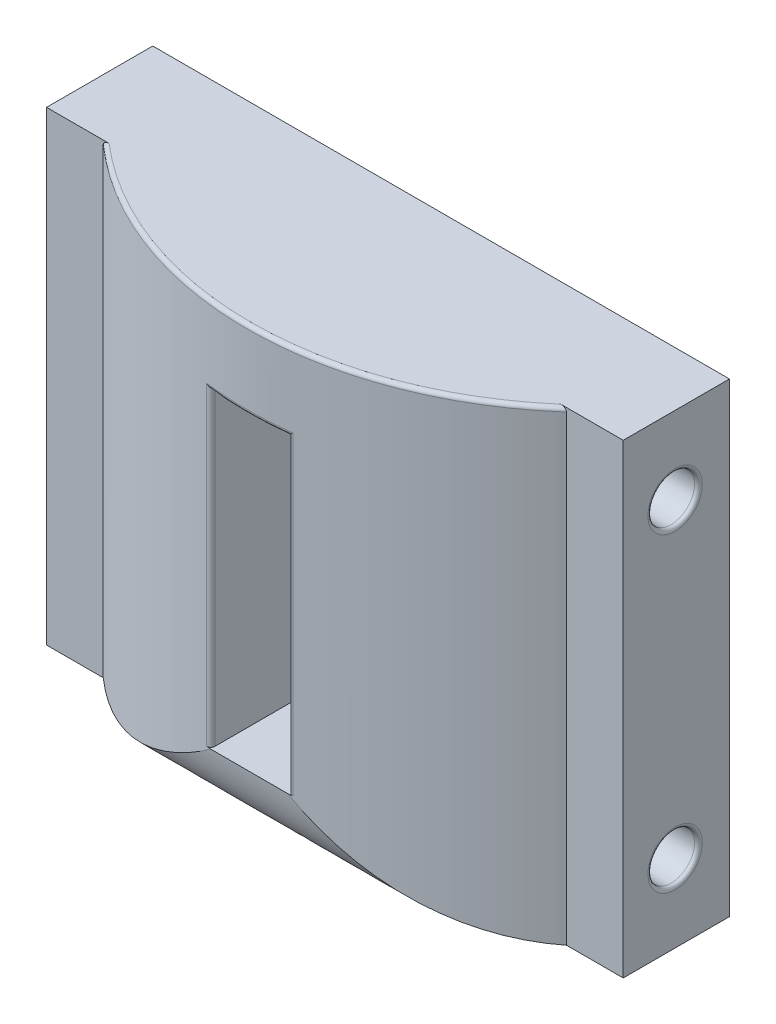
ISO-10303-21;
HEADER;
FILE_DESCRIPTION(('STEP AP214'),'2;1');
FILE_NAME('part.step','',(''),(''),'','','');
FILE_SCHEMA(('AUTOMOTIVE_DESIGN { 1 0 10303 214 1 1 1 1 }'));
ENDSEC;
DATA;
#1=APPLICATION_CONTEXT('core data for automotive mechanical design processes');
#2=APPLICATION_PROTOCOL_DEFINITION('international standard','automotive_design',2000,#1);
#3=PRODUCT_CONTEXT('',#1,'mechanical');
#4=PRODUCT('Part','Part','',(#3));
#5=PRODUCT_RELATED_PRODUCT_CATEGORY('part','',(#4));
#6=PRODUCT_DEFINITION_FORMATION('','',#4);
#7=PRODUCT_DEFINITION_CONTEXT('part definition',#1,'design');
#8=PRODUCT_DEFINITION('design','',#6,#7);
#9=PRODUCT_DEFINITION_SHAPE('','',#8);
#10=(LENGTH_UNIT() NAMED_UNIT(*) SI_UNIT(.MILLI.,.METRE.));
#11=(NAMED_UNIT(*) PLANE_ANGLE_UNIT() SI_UNIT($,.RADIAN.));
#12=(NAMED_UNIT(*) SI_UNIT($,.STERADIAN.) SOLID_ANGLE_UNIT());
#13=UNCERTAINTY_MEASURE_WITH_UNIT(LENGTH_MEASURE(1.E-05),#10,'distance_accuracy_value','');
#14=(GEOMETRIC_REPRESENTATION_CONTEXT(3) GLOBAL_UNCERTAINTY_ASSIGNED_CONTEXT((#13)) GLOBAL_UNIT_ASSIGNED_CONTEXT((#10,
#11,#12)) REPRESENTATION_CONTEXT('',''));
#15=CARTESIAN_POINT('',(0.,0.,0.));
#16=DIRECTION('',(0.,0.,1.));
#17=DIRECTION('',(1.,0.,0.));
#18=AXIS2_PLACEMENT_3D('',#15,#16,#17);
#19=CARTESIAN_POINT('',(12.425,25.,0.));
#20=DIRECTION('',(0.,1.,0.));
#21=DIRECTION('',(0.,0.,1.));
#22=AXIS2_PLACEMENT_3D('',#19,#20,#21);
#23=PLANE('',#22);
#24=DIRECTION('',(0.,0.,1.));
#25=VECTOR('',#24,1.);
#26=CARTESIAN_POINT('',(17.425,25.,0.));
#27=LINE('',#26,#25);
#28=CARTESIAN_POINT('',(17.425,25.,5.));
#29=VERTEX_POINT('',#28);
#30=CARTESIAN_POINT('',(17.425,25.,12.0795236098638));
#31=VERTEX_POINT('',#30);
#32=EDGE_CURVE('E199',#29,#31,#27,.T.);
#33=ORIENTED_EDGE('',*,*,#32,.T.);
#34=CARTESIAN_POINT('',(17.675,25.,12.0795236098638));
#35=DIRECTION('',(0.,1.,0.));
#36=DIRECTION('',(0.,0.,1.));
#37=AXIS2_PLACEMENT_3D('',#34,#35,#36);
#38=CIRCLE('',#37,0.249999999999997);
#39=CARTESIAN_POINT('',(17.4267446774114,25.,12.1090074156972));
#40=VERTEX_POINT('',#39);
#41=EDGE_CURVE('E366',#31,#40,#38,.T.);
#42=ORIENTED_EDGE('',*,*,#41,.T.);
#43=CARTESIAN_POINT('',(14.925,25.,-10.015728977273));
#44=DIRECTION('',(0.,1.,0.));
#45=DIRECTION('',(0.,0.,1.));
#46=AXIS2_PLACEMENT_3D('',#43,#44,#45);
#47=CIRCLE('',#46,22.265728977273);
#48=CARTESIAN_POINT('',(12.4232553225886,25.,12.1090074156972));
#49=VERTEX_POINT('',#48);
#50=EDGE_CURVE('E65',#40,#49,#47,.F.);
#51=ORIENTED_EDGE('',*,*,#50,.T.);
#52=CARTESIAN_POINT('',(12.175,25.,12.0795236098638));
#53=DIRECTION('',(0.,1.,0.));
#54=DIRECTION('',(0.,0.,1.));
#55=AXIS2_PLACEMENT_3D('',#52,#53,#54);
#56=CIRCLE('',#55,0.249999999999997);
#57=CARTESIAN_POINT('',(12.425,25.,12.0795236098638));
#58=VERTEX_POINT('',#57);
#59=EDGE_CURVE('E364',#49,#58,#56,.T.);
#60=ORIENTED_EDGE('',*,*,#59,.T.);
#61=DIRECTION('',(0.,0.,1.));
#62=VECTOR('',#61,1.);
#63=CARTESIAN_POINT('',(12.425,25.,0.));
#64=LINE('',#63,#62);
#65=CARTESIAN_POINT('',(12.425,25.,5.));
#66=VERTEX_POINT('',#65);
#67=EDGE_CURVE('E270',#66,#58,#64,.T.);
#68=ORIENTED_EDGE('',*,*,#67,.F.);
#69=DIRECTION('',(1.,0.,0.));
#70=VECTOR('',#69,1.);
#71=CARTESIAN_POINT('',(-3.65,25.,5.));
#72=LINE('',#71,#70);
#73=EDGE_CURVE('E290',#66,#29,#72,.T.);
#74=ORIENTED_EDGE('',*,*,#73,.T.);
#75=EDGE_LOOP('',(#33,#42,#51,#60,#68,#74));
#76=FACE_BOUND('',#75,.T.);
#77=ADVANCED_FACE('F34',(#76),#23,.F.);
#78=CARTESIAN_POINT('',(12.425,5.,0.));
#79=DIRECTION('',(0.,-1.,0.));
#80=DIRECTION('',(1.,0.,0.));
#81=AXIS2_PLACEMENT_3D('',#78,#79,#80);
#82=PLANE('',#81);
#83=DIRECTION('',(0.,0.,1.));
#84=VECTOR('',#83,1.);
#85=CARTESIAN_POINT('',(12.425,5.,0.));
#86=LINE('',#85,#84);
#87=CARTESIAN_POINT('',(12.425,5.,0.));
#88=VERTEX_POINT('',#87);
#89=CARTESIAN_POINT('',(12.425,4.99999999999999,2.));
#90=VERTEX_POINT('',#89);
#91=EDGE_CURVE('E193',#88,#90,#86,.T.);
#92=ORIENTED_EDGE('',*,*,#91,.T.);
#93=DIRECTION('',(1.,0.,0.));
#94=VECTOR('',#93,1.);
#95=CARTESIAN_POINT('',(-3.65,4.99999999999999,2.));
#96=LINE('',#95,#94);
#97=CARTESIAN_POINT('',(17.425,5.,2.));
#98=VERTEX_POINT('',#97);
#99=EDGE_CURVE('E177',#90,#98,#96,.T.);
#100=ORIENTED_EDGE('',*,*,#99,.T.);
#101=DIRECTION('',(0.,0.,1.));
#102=VECTOR('',#101,1.);
#103=CARTESIAN_POINT('',(17.425,5.,0.));
#104=LINE('',#103,#102);
#105=CARTESIAN_POINT('',(17.425,5.,0.));
#106=VERTEX_POINT('',#105);
#107=EDGE_CURVE('E191',#106,#98,#104,.T.);
#108=ORIENTED_EDGE('',*,*,#107,.F.);
#109=DIRECTION('',(1.,0.,0.));
#110=VECTOR('',#109,1.);
#111=CARTESIAN_POINT('',(12.425,5.,0.));
#112=LINE('',#111,#110);
#113=EDGE_CURVE('E264',#88,#106,#112,.T.);
#114=ORIENTED_EDGE('',*,*,#113,.F.);
#115=EDGE_LOOP('',(#92,#100,#108,#114));
#116=FACE_BOUND('',#115,.T.);
#117=ADVANCED_FACE('F189',(#116),#82,.F.);
#118=CARTESIAN_POINT('',(0.,0.,12.5));
#119=DIRECTION('',(0.,1.,0.));
#120=DIRECTION('',(0.,0.,1.));
#121=AXIS2_PLACEMENT_3D('',#118,#119,#120);
#122=PLANE('',#121);
#123=DIRECTION('',(1.,0.,0.));
#124=VECTOR('',#123,1.);
#125=CARTESIAN_POINT('',(0.,0.,0.));
#126=LINE('',#125,#124);
#127=CARTESIAN_POINT('',(-3.65,0.,0.));
#128=VERTEX_POINT('',#127);
#129=CARTESIAN_POINT('',(33.5,0.,0.));
#130=VERTEX_POINT('',#129);
#131=EDGE_CURVE('E209',#128,#130,#126,.T.);
#132=ORIENTED_EDGE('',*,*,#131,.T.);
#133=DIRECTION('',(0.,0.,-1.));
#134=VECTOR('',#133,1.);
#135=CARTESIAN_POINT('',(33.5,0.,6.84257539707056));
#136=LINE('',#135,#134);
#137=CARTESIAN_POINT('',(33.5,0.,6.84257539707056));
#138=VERTEX_POINT('',#137);
#139=EDGE_CURVE('E315',#138,#130,#136,.T.);
#140=ORIENTED_EDGE('',*,*,#139,.F.);
#141=DIRECTION('',(-1.,0.,0.));
#142=VECTOR('',#141,1.);
#143=CARTESIAN_POINT('',(33.5,0.,6.84257539707056));
#144=LINE('',#143,#142);
#145=CARTESIAN_POINT('',(29.85,0.,6.84257539707056));
#146=VERTEX_POINT('',#145);
#147=EDGE_CURVE('E247',#138,#146,#144,.T.);
#148=ORIENTED_EDGE('',*,*,#147,.T.);
#149=DIRECTION('',(1.,0.,0.));
#150=VECTOR('',#149,1.);
#151=CARTESIAN_POINT('',(0.,0.,6.84257539707056));
#152=LINE('',#151,#150);
#153=CARTESIAN_POINT('',(0.,0.,6.84257539707056));
#154=VERTEX_POINT('',#153);
#155=EDGE_CURVE('E249',#154,#146,#152,.T.);
#156=ORIENTED_EDGE('',*,*,#155,.F.);
#157=DIRECTION('',(1.,0.,0.));
#158=VECTOR('',#157,1.);
#159=CARTESIAN_POINT('',(-3.65,0.,6.84257539707056));
#160=LINE('',#159,#158);
#161=CARTESIAN_POINT('',(-3.65,0.,6.84257539707056));
#162=VERTEX_POINT('',#161);
#163=EDGE_CURVE('E309',#162,#154,#160,.T.);
#164=ORIENTED_EDGE('',*,*,#163,.F.);
#165=DIRECTION('',(0.,0.,1.));
#166=VECTOR('',#165,1.);
#167=CARTESIAN_POINT('',(-3.65,0.,0.));
#168=LINE('',#167,#166);
#169=EDGE_CURVE('E300',#128,#162,#168,.T.);
#170=ORIENTED_EDGE('',*,*,#169,.F.);
#171=EDGE_LOOP('',(#132,#140,#148,#156,#164,#170));
#172=FACE_BOUND('',#171,.T.);
#173=ADVANCED_FACE('F331',(#172),#122,.F.);
#174=CARTESIAN_POINT('',(0.,30.,12.5));
#175=DIRECTION('',(0.,-1.,0.));
#176=DIRECTION('',(0.,0.,-1.));
#177=AXIS2_PLACEMENT_3D('',#174,#175,#176);
#178=PLANE('',#177);
#179=CARTESIAN_POINT('',(14.925,30.,-10.015728977273));
#180=DIRECTION('',(0.,-1.,0.));
#181=DIRECTION('',(0.,0.,-1.));
#182=AXIS2_PLACEMENT_3D('',#179,#180,#181);
#183=CIRCLE('',#182,22.265728977273);
#184=CARTESIAN_POINT('',(0.37988877624637,30.,6.84257539707056));
#185=VERTEX_POINT('',#184);
#186=CARTESIAN_POINT('',(29.4701112237536,30.,6.84257539707056));
#187=VERTEX_POINT('',#186);
#188=EDGE_CURVE('E359',#185,#187,#183,.F.);
#189=ORIENTED_EDGE('',*,*,#188,.T.);
#190=DIRECTION('',(-1.,0.,0.));
#191=VECTOR('',#190,1.);
#192=CARTESIAN_POINT('',(33.5,30.,6.84257539707056));
#193=LINE('',#192,#191);
#194=CARTESIAN_POINT('',(33.5,30.,6.84257539707056));
#195=VERTEX_POINT('',#194);
#196=EDGE_CURVE('E322',#195,#187,#193,.T.);
#197=ORIENTED_EDGE('',*,*,#196,.F.);
#198=DIRECTION('',(0.,0.,1.));
#199=VECTOR('',#198,1.);
#200=CARTESIAN_POINT('',(33.5,30.,6.84257539707056));
#201=LINE('',#200,#199);
#202=CARTESIAN_POINT('',(33.5,30.,0.));
#203=VERTEX_POINT('',#202);
#204=EDGE_CURVE('E321',#203,#195,#201,.T.);
#205=ORIENTED_EDGE('',*,*,#204,.F.);
#206=DIRECTION('',(-1.,0.,0.));
#207=VECTOR('',#206,1.);
#208=CARTESIAN_POINT('',(0.,30.,0.));
#209=LINE('',#208,#207);
#210=CARTESIAN_POINT('',(-3.65,30.,0.));
#211=VERTEX_POINT('',#210);
#212=EDGE_CURVE('E211',#203,#211,#209,.T.);
#213=ORIENTED_EDGE('',*,*,#212,.T.);
#214=DIRECTION('',(0.,0.,-1.));
#215=VECTOR('',#214,1.);
#216=CARTESIAN_POINT('',(-3.65,30.,0.));
#217=LINE('',#216,#215);
#218=CARTESIAN_POINT('',(-3.65,30.,6.84257539707056));
#219=VERTEX_POINT('',#218);
#220=EDGE_CURVE('E304',#219,#211,#217,.T.);
#221=ORIENTED_EDGE('',*,*,#220,.F.);
#222=DIRECTION('',(1.,0.,0.));
#223=VECTOR('',#222,1.);
#224=CARTESIAN_POINT('',(-3.65,30.,6.84257539707056));
#225=LINE('',#224,#223);
#226=EDGE_CURVE('E307',#219,#185,#225,.T.);
#227=ORIENTED_EDGE('',*,*,#226,.T.);
#228=EDGE_LOOP('',(#189,#197,#205,#213,#221,#227));
#229=FACE_BOUND('',#228,.T.);
#230=ADVANCED_FACE('F409',(#229),#178,.F.);
#231=CARTESIAN_POINT('',(17.425,25.,0.));
#232=VERTEX_POINT('',#231);
#233=CARTESIAN_POINT('',(17.425,25.,2.));
#234=VERTEX_POINT('',#233);
#235=EDGE_CURVE('E203',#232,#234,#27,.T.);
#236=ORIENTED_EDGE('',*,*,#235,.T.);
#237=DIRECTION('',(1.,0.,0.));
#238=VECTOR('',#237,1.);
#239=CARTESIAN_POINT('',(-3.65,25.,2.));
#240=LINE('',#239,#238);
#241=CARTESIAN_POINT('',(12.425,25.,2.));
#242=VERTEX_POINT('',#241);
#243=EDGE_CURVE('E283',#234,#242,#240,.F.);
#244=ORIENTED_EDGE('',*,*,#243,.T.);
#245=CARTESIAN_POINT('',(12.425,25.,0.));
#246=VERTEX_POINT('',#245);
#247=EDGE_CURVE('E212',#246,#242,#64,.T.);
#248=ORIENTED_EDGE('',*,*,#247,.F.);
#249=DIRECTION('',(-1.,0.,0.));
#250=VECTOR('',#249,1.);
#251=CARTESIAN_POINT('',(12.425,25.,0.));
#252=LINE('',#251,#250);
#253=EDGE_CURVE('E267',#232,#246,#252,.T.);
#254=ORIENTED_EDGE('',*,*,#253,.F.);
#255=EDGE_LOOP('',(#236,#244,#248,#254));
#256=FACE_BOUND('',#255,.T.);
#257=ADVANCED_FACE('F282',(#256),#23,.F.);
#258=CARTESIAN_POINT('',(17.425,5.,5.));
#259=VERTEX_POINT('',#258);
#260=CARTESIAN_POINT('',(17.425,5.,12.0795236098638));
#261=VERTEX_POINT('',#260);
#262=EDGE_CURVE('E200',#259,#261,#104,.T.);
#263=ORIENTED_EDGE('',*,*,#262,.F.);
#264=DIRECTION('',(1.,0.,0.));
#265=VECTOR('',#264,1.);
#266=CARTESIAN_POINT('',(-3.65,4.99999999999999,5.));
#267=LINE('',#266,#265);
#268=CARTESIAN_POINT('',(12.425,4.99999999999999,5.));
#269=VERTEX_POINT('',#268);
#270=EDGE_CURVE('E180',#259,#269,#267,.F.);
#271=ORIENTED_EDGE('',*,*,#270,.T.);
#272=CARTESIAN_POINT('',(12.425,5.,12.0795236098638));
#273=VERTEX_POINT('',#272);
#274=EDGE_CURVE('E208',#269,#273,#86,.T.);
#275=ORIENTED_EDGE('',*,*,#274,.T.);
#276=CARTESIAN_POINT('',(12.175,5.,12.0795236098638));
#277=DIRECTION('',(0.,-1.,0.));
#278=DIRECTION('',(1.,0.,0.));
#279=AXIS2_PLACEMENT_3D('',#276,#277,#278);
#280=CIRCLE('',#279,0.249999999999997);
#281=CARTESIAN_POINT('',(12.1441229512089,5.,12.3276094979307));
#282=VERTEX_POINT('',#281);
#283=EDGE_CURVE('E362',#273,#282,#280,.T.);
#284=ORIENTED_EDGE('',*,*,#283,.T.);
#285=CARTESIAN_POINT('',(14.925,5.,-10.015728977273));
#286=DIRECTION('',(0.,-1.,0.));
#287=DIRECTION('',(1.,0.,0.));
#288=AXIS2_PLACEMENT_3D('',#285,#286,#287);
#289=CIRCLE('',#288,22.515728977273);
#290=CARTESIAN_POINT('',(12.425,5.,12.3607777067027));
#291=VERTEX_POINT('',#290);
#292=EDGE_CURVE('E57',#291,#282,#289,.T.);
#293=ORIENTED_EDGE('',*,*,#292,.F.);
#294=DIRECTION('',(1.,0.,0.));
#295=VECTOR('',#294,1.);
#296=CARTESIAN_POINT('',(0.,5.,12.3607777067027));
#297=LINE('',#296,#295);
#298=CARTESIAN_POINT('',(17.425,5.,12.3607777067027));
#299=VERTEX_POINT('',#298);
#300=EDGE_CURVE('E256',#291,#299,#297,.T.);
#301=ORIENTED_EDGE('',*,*,#300,.T.);
#302=CARTESIAN_POINT('',(14.925,5.,-10.015728977273));
#303=DIRECTION('',(0.,-1.,0.));
#304=DIRECTION('',(1.,0.,0.));
#305=AXIS2_PLACEMENT_3D('',#302,#303,#304);
#306=CIRCLE('',#305,22.515728977273);
#307=CARTESIAN_POINT('',(17.7058770487911,5.,12.3276094979307));
#308=VERTEX_POINT('',#307);
#309=EDGE_CURVE('E340',#308,#299,#306,.T.);
#310=ORIENTED_EDGE('',*,*,#309,.F.);
#311=CARTESIAN_POINT('',(17.675,5.,12.0795236098638));
#312=DIRECTION('',(0.,-1.,0.));
#313=DIRECTION('',(1.,0.,0.));
#314=AXIS2_PLACEMENT_3D('',#311,#312,#313);
#315=CIRCLE('',#314,0.249999999999997);
#316=EDGE_CURVE('E368',#308,#261,#315,.T.);
#317=ORIENTED_EDGE('',*,*,#316,.T.);
#318=EDGE_LOOP('',(#263,#271,#275,#284,#293,#301,#310,#317));
#319=FACE_BOUND('',#318,.T.);
#320=ADVANCED_FACE('F406',(#319),#82,.F.);
#321=CARTESIAN_POINT('',(0.,0.,0.));
#322=DIRECTION('',(0.,0.,-1.));
#323=DIRECTION('',(-1.,0.,0.));
#324=AXIS2_PLACEMENT_3D('',#321,#322,#323);
#325=PLANE('',#324);
#326=DIRECTION('',(0.,-1.,0.));
#327=VECTOR('',#326,1.);
#328=CARTESIAN_POINT('',(12.425,25.,0.));
#329=LINE('',#328,#327);
#330=EDGE_CURVE('E261',#246,#88,#329,.T.);
#331=ORIENTED_EDGE('',*,*,#330,.T.);
#332=ORIENTED_EDGE('',*,*,#113,.T.);
#333=DIRECTION('',(0.,1.,0.));
#334=VECTOR('',#333,1.);
#335=CARTESIAN_POINT('',(17.425,25.,0.));
#336=LINE('',#335,#334);
#337=EDGE_CURVE('E198',#106,#232,#336,.T.);
#338=ORIENTED_EDGE('',*,*,#337,.T.);
#339=ORIENTED_EDGE('',*,*,#253,.T.);
#340=EDGE_LOOP('',(#331,#332,#338,#339));
#341=FACE_BOUND('',#340,.T.);
#342=ORIENTED_EDGE('',*,*,#131,.F.);
#343=DIRECTION('',(0.,-1.,0.));
#344=VECTOR('',#343,1.);
#345=CARTESIAN_POINT('',(-3.65,30.,0.));
#346=LINE('',#345,#344);
#347=EDGE_CURVE('E297',#211,#128,#346,.T.);
#348=ORIENTED_EDGE('',*,*,#347,.F.);
#349=ORIENTED_EDGE('',*,*,#212,.F.);
#350=DIRECTION('',(0.,1.,0.));
#351=VECTOR('',#350,1.);
#352=CARTESIAN_POINT('',(33.5,30.,0.));
#353=LINE('',#352,#351);
#354=EDGE_CURVE('E318',#130,#203,#353,.T.);
#355=ORIENTED_EDGE('',*,*,#354,.F.);
#356=EDGE_LOOP('',(#342,#348,#349,#355));
#357=FACE_BOUND('',#356,.T.);
#358=ADVANCED_FACE('F414',(#341,#357),#325,.T.);
#359=CARTESIAN_POINT('',(12.425,25.,0.));
#360=DIRECTION('',(-1.,0.,0.));
#361=DIRECTION('',(0.,0.,1.));
#362=AXIS2_PLACEMENT_3D('',#359,#360,#361);
#363=PLANE('',#362);
#364=ORIENTED_EDGE('',*,*,#67,.T.);
#365=DIRECTION('',(0.,-1.,0.));
#366=VECTOR('',#365,1.);
#367=CARTESIAN_POINT('',(12.425,25.,12.0795236098638));
#368=LINE('',#367,#366);
#369=EDGE_CURVE('E348',#58,#273,#368,.T.);
#370=ORIENTED_EDGE('',*,*,#369,.T.);
#371=ORIENTED_EDGE('',*,*,#274,.F.);
#372=CARTESIAN_POINT('',(12.425,5.,3.5));
#373=DIRECTION('',(-1.,0.,0.));
#374=DIRECTION('',(0.,0.,1.));
#375=AXIS2_PLACEMENT_3D('',#372,#373,#374);
#376=CIRCLE('',#375,1.5);
#377=EDGE_CURVE('E194',#269,#90,#376,.T.);
#378=ORIENTED_EDGE('',*,*,#377,.T.);
#379=ORIENTED_EDGE('',*,*,#91,.F.);
#380=ORIENTED_EDGE('',*,*,#330,.F.);
#381=ORIENTED_EDGE('',*,*,#247,.T.);
#382=CARTESIAN_POINT('',(12.425,25.,3.5));
#383=DIRECTION('',(-1.,0.,0.));
#384=DIRECTION('',(0.,0.,1.));
#385=AXIS2_PLACEMENT_3D('',#382,#383,#384);
#386=CIRCLE('',#385,1.5);
#387=EDGE_CURVE('E295',#242,#66,#386,.T.);
#388=ORIENTED_EDGE('',*,*,#387,.T.);
#389=EDGE_LOOP('',(#364,#370,#371,#378,#379,#380,#381,#388));
#390=FACE_BOUND('',#389,.T.);
#391=ADVANCED_FACE('F488',(#390),#363,.F.);
#392=CARTESIAN_POINT('',(17.425,25.,0.));
#393=DIRECTION('',(1.,0.,0.));
#394=DIRECTION('',(0.,1.,0.));
#395=AXIS2_PLACEMENT_3D('',#392,#393,#394);
#396=PLANE('',#395);
#397=ORIENTED_EDGE('',*,*,#262,.T.);
#398=DIRECTION('',(0.,-1.,0.));
#399=VECTOR('',#398,1.);
#400=CARTESIAN_POINT('',(17.425,25.,12.0795236098638));
#401=LINE('',#400,#399);
#402=EDGE_CURVE('E357',#261,#31,#401,.F.);
#403=ORIENTED_EDGE('',*,*,#402,.T.);
#404=ORIENTED_EDGE('',*,*,#32,.F.);
#405=CARTESIAN_POINT('',(17.425,25.,3.5));
#406=DIRECTION('',(1.,0.,0.));
#407=DIRECTION('',(0.,1.,0.));
#408=AXIS2_PLACEMENT_3D('',#405,#406,#407);
#409=CIRCLE('',#408,1.5);
#410=EDGE_CURVE('E286',#29,#234,#409,.T.);
#411=ORIENTED_EDGE('',*,*,#410,.T.);
#412=ORIENTED_EDGE('',*,*,#235,.F.);
#413=ORIENTED_EDGE('',*,*,#337,.F.);
#414=ORIENTED_EDGE('',*,*,#107,.T.);
#415=CARTESIAN_POINT('',(17.425,5.,3.5));
#416=DIRECTION('',(1.,0.,0.));
#417=DIRECTION('',(0.,1.,0.));
#418=AXIS2_PLACEMENT_3D('',#415,#416,#417);
#419=CIRCLE('',#418,1.5);
#420=EDGE_CURVE('E174',#98,#259,#419,.T.);
#421=ORIENTED_EDGE('',*,*,#420,.T.);
#422=EDGE_LOOP('',(#397,#403,#404,#411,#412,#413,#414,#421));
#423=FACE_BOUND('',#422,.T.);
#424=ADVANCED_FACE('F196',(#423),#396,.F.);
#425=CARTESIAN_POINT('',(14.925,30.,-10.015728977273));
#426=DIRECTION('',(0.,-1.,0.));
#427=DIRECTION('',(0.,0.,-1.));
#428=AXIS2_PLACEMENT_3D('',#425,#426,#427);
#429=CYLINDRICAL_SURFACE('',#428,22.515728977273);
#430=CARTESIAN_POINT('',(0.,0.,6.84257539707056));
#431=CARTESIAN_POINT('',(0.193042924293075,0.0105360780061061,7.01349183127974));
#432=CARTESIAN_POINT('',(0.388906323343305,0.0252280484383451,7.18096749797409));
#433=CARTESIAN_POINT('',(0.785732092405606,0.0629811417705993,7.50868978841787));
#434=CARTESIAN_POINT('',(0.98669331603935,0.0860403983171284,7.66893801531915));
#435=CARTESIAN_POINT('',(1.39323957189947,0.140587432132164,7.98191923481646));
#436=CARTESIAN_POINT('',(1.59882415431426,0.172074392681899,8.13465295393754));
#437=CARTESIAN_POINT('',(2.01332232080926,0.243344935785726,8.43180226795411));
#438=CARTESIAN_POINT('',(2.22222048377115,0.283096882093108,8.57624697617793));
#439=CARTESIAN_POINT('',(2.64357274963921,0.370932011358048,8.8572335819139));
#440=CARTESIAN_POINT('',(2.85602706630504,0.419015696771154,8.99377500214588));
#441=CARTESIAN_POINT('',(3.28392996420327,0.523424593397298,9.25878548315417));
#442=CARTESIAN_POINT('',(3.49937880203167,0.579750514864721,9.38725384688959));
#443=CARTESIAN_POINT('',(4.10533875268703,0.748638799023607,9.735075686924));
#444=CARTESIAN_POINT('',(4.49862139600964,0.870263179812045,9.94532930201878));
#445=CARTESIAN_POINT('',(5.2899123195179,1.13873175445913,10.3390877315719));
#446=CARTESIAN_POINT('',(5.68792119895615,1.2855791788978,10.522589114018));
#447=CARTESIAN_POINT('',(6.48655261192548,1.60356219175778,10.8634369250289));
#448=CARTESIAN_POINT('',(6.88717893652851,1.77474962446827,11.0207259264319));
#449=CARTESIAN_POINT('',(7.68745040832775,2.13980062315123,11.3092992949096));
#450=CARTESIAN_POINT('',(8.08709557763833,2.3336636731547,11.4405842535064));
#451=CARTESIAN_POINT('',(8.71108534447592,2.65449140304521,11.6268467293381));
#452=CARTESIAN_POINT('',(8.93667638174192,2.77423585822373,11.6903099537629));
#453=CARTESIAN_POINT('',(9.38623056067804,3.02046732099641,11.8093512038809));
#454=CARTESIAN_POINT('',(9.61019389499442,3.14695351540499,11.8649301776213));
#455=CARTESIAN_POINT('',(10.0559816151476,3.40657746477265,11.9684260617934));
#456=CARTESIAN_POINT('',(10.2778062424441,3.53971445811326,12.0163438469209));
#457=CARTESIAN_POINT('',(10.7178996161996,3.81219729878258,12.1045897730986));
#458=CARTESIAN_POINT('',(10.9361789929793,3.95151635958402,12.1449473285163));
#459=CARTESIAN_POINT('',(11.2609711444217,4.16583684379342,12.2001440600184));
#460=CARTESIAN_POINT('',(11.3688021859396,4.23817070770317,12.2176537070145));
#461=CARTESIAN_POINT('',(11.5834335632459,4.38474160502245,12.2509226513754));
#462=CARTESIAN_POINT('',(11.6902339336707,4.4589785741681,12.2666820077483));
#463=CARTESIAN_POINT('',(11.9026399623266,4.60956892414532,12.2964850325445));
#464=CARTESIAN_POINT('',(12.0082451536502,4.68592309444772,12.3105280501237));
#465=CARTESIAN_POINT('',(12.1654881618308,4.80225466280465,12.3303207409665));
#466=CARTESIAN_POINT('',(12.2177113997909,4.84133425153366,12.3367066695535));
#467=CARTESIAN_POINT('',(12.3217083778362,4.92015539099301,12.3490573738576));
#468=CARTESIAN_POINT('',(12.373482104742,4.95989696103316,12.3550221372626));
#469=CARTESIAN_POINT('',(12.425,5.,12.3607777067027));
#470=B_SPLINE_CURVE_WITH_KNOTS('',3,(#430,#431,#432,#433,#434,#435,#436,#437,#438,#439,#440,
#441,#442,#443,#444,#445,#446,#447,#448,#449,#450,#451,#452,#453,#454,#455,#456,#457,#458,#459,
#460,#461,#462,#463,#464,#465,#466,#467,#468,#469),.UNSPECIFIED.,.F.,.F.,(4,2,2,2,2,2,2,2,2,2,2,
2,2,2,2,2,2,2,2,4),(0.,0.774074870226813,1.5479771862782,2.32180453151358,3.09272266698517,
3.86368730979291,4.63471842774514,6.01979415143932,7.40504740878879,8.7932967362101,
10.1815144810597,10.970839702955,11.7600699313066,12.5492099869554,13.3352129193303,
13.7282498837714,14.1212735936154,14.5144458806322,14.7110551103968,14.9076700852713),.UNSPECIFIED.);
#471=EDGE_CURVE('E223',#154,#291,#470,.T.);
#472=ORIENTED_EDGE('',*,*,#471,.T.);
#473=ORIENTED_EDGE('',*,*,#292,.T.);
#474=DIRECTION('',(0.,-1.,0.));
#475=VECTOR('',#474,1.);
#476=CARTESIAN_POINT('',(12.1441229512089,30.,12.3276094979307));
#477=LINE('',#476,#475);
#478=CARTESIAN_POINT('',(12.1441229512089,25.25,12.3276094979307));
#479=VERTEX_POINT('',#478);
#480=EDGE_CURVE('E353',#282,#479,#477,.F.);
#481=ORIENTED_EDGE('',*,*,#480,.T.);
#482=CARTESIAN_POINT('',(14.925,25.25,-10.015728977273));
#483=DIRECTION('',(0.,1.,0.));
#484=DIRECTION('',(0.,0.,1.));
#485=AXIS2_PLACEMENT_3D('',#482,#483,#484);
#486=CIRCLE('',#485,22.515728977273);
#487=CARTESIAN_POINT('',(17.7058770487911,25.25,12.3276094979307));
#488=VERTEX_POINT('',#487);
#489=EDGE_CURVE('E346',#479,#488,#486,.T.);
#490=ORIENTED_EDGE('',*,*,#489,.T.);
#491=DIRECTION('',(0.,-1.,0.));
#492=VECTOR('',#491,1.);
#493=CARTESIAN_POINT('',(17.7058770487911,30.,12.3276094979307));
#494=LINE('',#493,#492);
#495=EDGE_CURVE('E342',#488,#308,#494,.T.);
#496=ORIENTED_EDGE('',*,*,#495,.T.);
#497=ORIENTED_EDGE('',*,*,#309,.T.);
#498=CARTESIAN_POINT('',(17.425,5.,12.3607777067027));
#499=CARTESIAN_POINT('',(17.493758877554,4.94648381945863,12.3530963458405));
#500=CARTESIAN_POINT('',(17.5629664971035,4.89360490253467,12.3450425948917));
#501=CARTESIAN_POINT('',(17.7021458993923,4.7889916890801,12.3281833578496));
#502=CARTESIAN_POINT('',(17.7721176422496,4.73725733323368,12.3193779108278));
#503=CARTESIAN_POINT('',(17.9829647979465,4.58358632531794,12.2918256187379));
#504=CARTESIAN_POINT('',(18.1247967745815,4.48316272460989,12.271940085938));
#505=CARTESIAN_POINT('',(18.4103980151279,4.28578133653921,12.2290662539766));
#506=CARTESIAN_POINT('',(18.5541674353555,4.18882383116057,12.2060777030926));
#507=CARTESIAN_POINT('',(18.8432729293061,3.99808609409905,12.1569273918692));
#508=CARTESIAN_POINT('',(18.9886090847476,3.90430602921363,12.1307654652749));
#509=CARTESIAN_POINT('',(19.2806064571762,3.71976110999591,12.07519304149));
#510=CARTESIAN_POINT('',(19.4272679053328,3.62899679513477,12.0457819671035));
#511=CARTESIAN_POINT('',(19.7216839403996,3.45044061665555,11.9836463617942));
#512=CARTESIAN_POINT('',(19.8694385041594,3.36264869030524,11.9509219008587));
#513=CARTESIAN_POINT('',(20.3160276248732,3.10257183506957,11.8472228074977));
#514=CARTESIAN_POINT('',(20.6163063163827,2.93477146283737,11.7710775579388));
#515=CARTESIAN_POINT('',(21.2194342823419,2.61135925469161,11.6045402679696));
#516=CARTESIAN_POINT('',(21.5222834359171,2.45574684912735,11.5141488940015));
#517=CARTESIAN_POINT('',(22.1294747508051,2.15718101504825,11.3186402166671));
#518=CARTESIAN_POINT('',(22.4338168813084,2.01422732645549,11.2135232159588));
#519=CARTESIAN_POINT('',(23.0453414018168,1.74044409148934,10.9872532469314));
#520=CARTESIAN_POINT('',(23.3525266583777,1.60972330290652,10.865976121267));
#521=CARTESIAN_POINT('',(23.9660115105699,1.36235788811957,10.6077749918668));
#522=CARTESIAN_POINT('',(24.2723110852974,1.24571359154522,10.4708506218648));
#523=CARTESIAN_POINT('',(24.8827275820302,1.02708218512747,10.1811977568158));
#524=CARTESIAN_POINT('',(25.1868442145436,0.925096986395305,10.0284672055682));
#525=CARTESIAN_POINT('',(25.7901245825706,0.736736068724703,9.70794374578511));
#526=CARTESIAN_POINT('',(26.0893042311426,0.650293590727891,9.54022012623285));
#527=CARTESIAN_POINT('',(26.6826066129917,0.492882807159538,9.18936175002633));
#528=CARTESIAN_POINT('',(26.9767299405421,0.421912671499158,9.00622881956074));
#529=CARTESIAN_POINT('',(27.5583538243568,0.295741370002693,8.62501155109572));
#530=CARTESIAN_POINT('',(27.8458585974867,0.24052989302955,8.42693709734764));
#531=CARTESIAN_POINT('',(28.2775854917664,0.168515481378155,8.11435706541648));
#532=CARTESIAN_POINT('',(28.4246889270319,0.145959204996398,8.00509610367831));
#533=CARTESIAN_POINT('',(28.7165211411944,0.105168504541971,7.78274323444175));
#534=CARTESIAN_POINT('',(28.8612505573995,0.08693290230287,7.6696523809183));
#535=CARTESIAN_POINT('',(29.291741241196,0.0386610446384208,7.32469182262306));
#536=CARTESIAN_POINT('',(29.5737350869413,0.0150713481509645,7.08718467103634));
#537=CARTESIAN_POINT('',(29.85,0.,6.84257539707056));
#538=B_SPLINE_CURVE_WITH_KNOTS('',3,(#498,#499,#500,#501,#502,#503,#504,#505,#506,#507,#508,
#509,#510,#511,#512,#513,#514,#515,#516,#517,#518,#519,#520,#521,#522,#523,#524,#525,#526,#527,
#528,#529,#530,#531,#532,#533,#534,#535,#536,#537),.UNSPECIFIED.,.F.,.F.,(4,2,2,2,2,2,2,2,2,2,2,
2,2,2,2,2,2,2,2,4),(0.,0.262394612488561,0.524775594614539,1.04944389504016,1.57415478313565,
2.09889317301388,2.6237249305842,3.14854560467333,4.20493437861327,5.26127374872911,
6.31759141093175,7.38255098831258,8.44753549905843,9.51265872648627,10.5730916627898,
11.633399101569,12.6930111657688,13.2467935608519,13.8004247756738,14.9079476518883),.UNSPECIFIED.);
#539=EDGE_CURVE('E214',#299,#146,#538,.T.);
#540=ORIENTED_EDGE('',*,*,#539,.T.);
#541=DIRECTION('',(0.,-1.,0.));
#542=VECTOR('',#541,1.);
#543=CARTESIAN_POINT('',(29.85,30.,6.84257539707056));
#544=LINE('',#543,#542);
#545=CARTESIAN_POINT('',(29.85,29.75,6.84257539707056));
#546=VERTEX_POINT('',#545);
#547=EDGE_CURVE('E259',#546,#146,#544,.T.);
#548=ORIENTED_EDGE('',*,*,#547,.F.);
#549=CARTESIAN_POINT('',(14.925,29.75,-10.015728977273));
#550=DIRECTION('',(0.,-1.,0.));
#551=DIRECTION('',(0.,0.,-1.));
#552=AXIS2_PLACEMENT_3D('',#549,#550,#551);
#553=CIRCLE('',#552,22.515728977273);
#554=CARTESIAN_POINT('',(0.,29.75,6.84257539707056));
#555=VERTEX_POINT('',#554);
#556=EDGE_CURVE('E344',#546,#555,#553,.T.);
#557=ORIENTED_EDGE('',*,*,#556,.T.);
#558=DIRECTION('',(0.,-1.,0.));
#559=VECTOR('',#558,1.);
#560=CARTESIAN_POINT('',(0.,30.,6.84257539707056));
#561=LINE('',#560,#559);
#562=EDGE_CURVE('E255',#555,#154,#561,.T.);
#563=ORIENTED_EDGE('',*,*,#562,.T.);
#564=EDGE_LOOP('',(#472,#473,#481,#490,#496,#497,#540,#548,#557,#563));
#565=FACE_BOUND('',#564,.T.);
#566=ADVANCED_FACE('F229',(#565),#429,.T.);
#567=CARTESIAN_POINT('',(0.,0.,6.84257539707056));
#568=CARTESIAN_POINT('',(0.,0.298823628176122,11.6861209825142));
#569=CARTESIAN_POINT('',(0.,5.,12.3607777067027));
#570=B_SPLINE_CURVE_WITH_KNOTS('',2,(#567,#568,#569),.UNSPECIFIED.,.F.,.F.,(3,3),(0.,1.),.UNSPECIFIED.);
#571=DIRECTION('',(1.,0.,0.));
#572=VECTOR('',#571,1.);
#573=SURFACE_OF_LINEAR_EXTRUSION('',#570,#572);
#574=ORIENTED_EDGE('',*,*,#155,.T.);
#575=ORIENTED_EDGE('',*,*,#539,.F.);
#576=ORIENTED_EDGE('',*,*,#300,.F.);
#577=ORIENTED_EDGE('',*,*,#471,.F.);
#578=EDGE_LOOP('',(#574,#575,#576,#577));
#579=FACE_BOUND('',#578,.T.);
#580=ADVANCED_FACE('F232',(#579),#573,.F.);
#581=CARTESIAN_POINT('',(33.5,30.,6.84257539707056));
#582=DIRECTION('',(0.,0.,-1.));
#583=DIRECTION('',(-1.,0.,0.));
#584=AXIS2_PLACEMENT_3D('',#581,#582,#583);
#585=PLANE('',#584);
#586=ORIENTED_EDGE('',*,*,#196,.T.);
#587=CARTESIAN_POINT('',(29.4701112237536,30.,6.84257539707056));
#588=CARTESIAN_POINT('',(29.4858561768216,29.9999946611028,6.84257539707056));
#589=CARTESIAN_POINT('',(29.5015890334673,29.9993653859412,6.84257539707056));
#590=CARTESIAN_POINT('',(29.5329834218373,29.9968141850523,6.84257539707056));
#591=CARTESIAN_POINT('',(29.5486447234688,29.994889445852,6.84257539707056));
#592=CARTESIAN_POINT('',(29.5956639913347,29.9870557418506,6.84257539707056));
#593=CARTESIAN_POINT('',(29.6267326031333,29.9790853447756,6.84257539707056));
#594=CARTESIAN_POINT('',(29.6743408116883,29.961511348066,6.84257539707056));
#595=CARTESIAN_POINT('',(29.6916317265655,29.9539044209407,6.84257539707056));
#596=CARTESIAN_POINT('',(29.724927352769,29.9363136930655,6.84257539707056));
#597=CARTESIAN_POINT('',(29.7409363335406,29.9263382619128,6.84257539707056));
#598=CARTESIAN_POINT('',(29.7671887037568,29.906609864936,6.84257539707056));
#599=CARTESIAN_POINT('',(29.7778667083525,29.8974378097274,6.84257539707056));
#600=CARTESIAN_POINT('',(29.7976783812754,29.8775366148658,6.84257539707056));
#601=CARTESIAN_POINT('',(29.8068137186104,29.8668091816399,6.84257539707056));
#602=CARTESIAN_POINT('',(29.821038967014,29.8465371627216,6.84257539707056));
#603=CARTESIAN_POINT('',(29.8265750531335,29.8373070477321,6.84257539707056));
#604=CARTESIAN_POINT('',(29.8360635942599,29.8180767241114,6.84257539707056));
#605=CARTESIAN_POINT('',(29.8400200071901,29.8080785159539,6.84257539707056));
#606=CARTESIAN_POINT('',(29.8453127622258,29.7900713902915,6.84257539707056));
#607=CARTESIAN_POINT('',(29.8470548833316,29.7821810911568,6.84257539707056));
#608=CARTESIAN_POINT('',(29.8494058079322,29.7661979181292,6.84257539707056));
#609=CARTESIAN_POINT('',(29.8500094077228,29.7581042846142,6.84257539707056));
#610=CARTESIAN_POINT('',(29.85,29.75,6.84257539707056));
#611=B_SPLINE_CURVE_WITH_KNOTS('',3,(#587,#588,#589,#590,#591,#592,#593,#594,#595,#596,#597,
#598,#599,#600,#601,#602,#603,#604,#605,#606,#607,#608,#609,#610),.UNSPECIFIED.,.F.,.F.,(4,2,2,
2,2,2,2,2,2,2,2,4),(0.,0.047196538061446,0.0944959091521585,0.190057902747077,0.246589026882507,
0.302923284176891,0.345020429828605,0.387071734765127,0.419240793729206,0.451328738499933,
0.475491042717091,0.499763517597051),.UNSPECIFIED.);
#612=EDGE_CURVE('E49',#187,#546,#611,.T.);
#613=ORIENTED_EDGE('',*,*,#612,.T.);
#614=ORIENTED_EDGE('',*,*,#547,.T.);
#615=ORIENTED_EDGE('',*,*,#147,.F.);
#616=DIRECTION('',(0.,-1.,0.));
#617=VECTOR('',#616,1.);
#618=CARTESIAN_POINT('',(33.5,30.,6.84257539707056));
#619=LINE('',#618,#617);
#620=EDGE_CURVE('E312',#195,#138,#619,.T.);
#621=ORIENTED_EDGE('',*,*,#620,.F.);
#622=EDGE_LOOP('',(#586,#613,#614,#615,#621));
#623=FACE_BOUND('',#622,.T.);
#624=ADVANCED_FACE('F237',(#623),#585,.F.);
#625=CARTESIAN_POINT('',(33.5,0.,0.));
#626=DIRECTION('',(1.,0.,0.));
#627=DIRECTION('',(0.,0.,-1.));
#628=AXIS2_PLACEMENT_3D('',#625,#626,#627);
#629=PLANE('',#628);
#630=CARTESIAN_POINT('',(33.5,5.,3.5));
#631=DIRECTION('',(1.,0.,0.));
#632=DIRECTION('',(0.,0.,-1.));
#633=AXIS2_PLACEMENT_3D('',#630,#631,#632);
#634=CIRCLE('',#633,1.75);
#635=CARTESIAN_POINT('',(33.5,5.,1.75));
#636=VERTEX_POINT('',#635);
#637=EDGE_CURVE('E473',#636,#636,#634,.F.);
#638=ORIENTED_EDGE('',*,*,#637,.T.);
#639=EDGE_LOOP('',(#638));
#640=FACE_BOUND('',#639,.T.);
#641=CARTESIAN_POINT('',(33.5,25.,3.5));
#642=DIRECTION('',(1.,0.,0.));
#643=DIRECTION('',(0.,0.,-1.));
#644=AXIS2_PLACEMENT_3D('',#641,#642,#643);
#645=CIRCLE('',#644,1.75);
#646=CARTESIAN_POINT('',(33.5,25.,1.75));
#647=VERTEX_POINT('',#646);
#648=EDGE_CURVE('E468',#647,#647,#645,.F.);
#649=ORIENTED_EDGE('',*,*,#648,.T.);
#650=EDGE_LOOP('',(#649));
#651=FACE_BOUND('',#650,.T.);
#652=ORIENTED_EDGE('',*,*,#620,.T.);
#653=ORIENTED_EDGE('',*,*,#139,.T.);
#654=ORIENTED_EDGE('',*,*,#354,.T.);
#655=ORIENTED_EDGE('',*,*,#204,.T.);
#656=EDGE_LOOP('',(#652,#653,#654,#655));
#657=FACE_BOUND('',#656,.T.);
#658=ADVANCED_FACE('F390',(#640,#651,#657),#629,.T.);
#659=CARTESIAN_POINT('',(-3.65,30.,6.84257539707056));
#660=DIRECTION('',(0.,0.,-1.));
#661=DIRECTION('',(-1.,0.,0.));
#662=AXIS2_PLACEMENT_3D('',#659,#660,#661);
#663=PLANE('',#662);
#664=ORIENTED_EDGE('',*,*,#562,.F.);
#665=CARTESIAN_POINT('',(0.,29.75,6.84257539707056));
#666=CARTESIAN_POINT('',(-2.88664351446239E-05,29.7608178408585,6.84257539707056));
#667=CARTESIAN_POINT('',(0.00105723038845568,29.7716027597086,6.84257539707056));
#668=CARTESIAN_POINT('',(0.00520307170359355,29.7926807368079,6.84257539707056));
#669=CARTESIAN_POINT('',(0.00824318936082045,29.8029776048339,6.84257539707056));
#670=CARTESIAN_POINT('',(0.0160364214146226,29.8228462486557,6.84257539707056));
#671=CARTESIAN_POINT('',(0.0207836853365983,29.832420367386,6.84257539707056));
#672=CARTESIAN_POINT('',(0.0316814560515758,29.8507520446296,6.84257539707056));
#673=CARTESIAN_POINT('',(0.0378356106678288,29.8595073955733,6.84257539707056));
#674=CARTESIAN_POINT('',(0.0543587753876319,29.8799728865982,6.84257539707056));
#675=CARTESIAN_POINT('',(0.0653594122866446,29.8911721669058,6.84257539707056));
#676=CARTESIAN_POINT('',(0.0889844123658948,29.9116881001384,6.84257539707056));
#677=CARTESIAN_POINT('',(0.101611850753604,29.9210010993185,6.84257539707056));
#678=CARTESIAN_POINT('',(0.134227519325345,29.9418845590705,6.84257539707056));
#679=CARTESIAN_POINT('',(0.154867927274966,29.9524329979102,6.84257539707056));
#680=CARTESIAN_POINT('',(0.197552330097864,29.970202885107,6.84257539707056));
#681=CARTESIAN_POINT('',(0.219600309019218,29.9774143659716,6.84257539707056));
#682=CARTESIAN_POINT('',(0.2646205768757,29.9888707125805,6.84257539707056));
#683=CARTESIAN_POINT('',(0.287598697206129,29.9930921948517,6.84257539707056));
#684=CARTESIAN_POINT('',(0.333692485823064,29.9986329425588,6.84257539707056));
#685=CARTESIAN_POINT('',(0.3568049530722,29.9999785043132,6.84257539707056));
#686=CARTESIAN_POINT('',(0.379888776246369,30.,6.84257539707056));
#687=B_SPLINE_CURVE_WITH_KNOTS('',3,(#665,#666,#667,#668,#669,#670,#671,#672,#673,#674,#675,
#676,#677,#678,#679,#680,#681,#682,#683,#684,#685,#686),.UNSPECIFIED.,.F.,.F.,(4,2,2,2,2,2,2,2,
2,2,4),(0.,0.0323469346851668,0.0643739383179348,0.0962922137797576,0.128294205760145,
0.175125851671921,0.222047361212371,0.291207174285894,0.360572254976866,0.430473992661378,
0.499733791796253),.UNSPECIFIED.);
#688=EDGE_CURVE('E11',#555,#185,#687,.T.);
#689=ORIENTED_EDGE('',*,*,#688,.T.);
#690=ORIENTED_EDGE('',*,*,#226,.F.);
#691=DIRECTION('',(0.,1.,0.));
#692=VECTOR('',#691,1.);
#693=CARTESIAN_POINT('',(-3.65,30.,6.84257539707056));
#694=LINE('',#693,#692);
#695=EDGE_CURVE('E302',#162,#219,#694,.T.);
#696=ORIENTED_EDGE('',*,*,#695,.F.);
#697=ORIENTED_EDGE('',*,*,#163,.T.);
#698=EDGE_LOOP('',(#664,#689,#690,#696,#697));
#699=FACE_BOUND('',#698,.T.);
#700=ADVANCED_FACE('F385',(#699),#663,.F.);
#701=CARTESIAN_POINT('',(-3.65,0.,0.));
#702=DIRECTION('',(-1.,0.,0.));
#703=DIRECTION('',(0.,0.,1.));
#704=AXIS2_PLACEMENT_3D('',#701,#702,#703);
#705=PLANE('',#704);
#706=CARTESIAN_POINT('',(-3.65,5.,3.5));
#707=DIRECTION('',(-1.,0.,0.));
#708=DIRECTION('',(0.,0.,1.));
#709=AXIS2_PLACEMENT_3D('',#706,#707,#708);
#710=CIRCLE('',#709,1.75);
#711=CARTESIAN_POINT('',(-3.65,5.,5.25));
#712=VERTEX_POINT('',#711);
#713=EDGE_CURVE('E484',#712,#712,#710,.F.);
#714=ORIENTED_EDGE('',*,*,#713,.T.);
#715=EDGE_LOOP('',(#714));
#716=FACE_BOUND('',#715,.T.);
#717=CARTESIAN_POINT('',(-3.65,25.,3.5));
#718=DIRECTION('',(-1.,0.,0.));
#719=DIRECTION('',(0.,0.,1.));
#720=AXIS2_PLACEMENT_3D('',#717,#718,#719);
#721=CIRCLE('',#720,1.75);
#722=CARTESIAN_POINT('',(-3.65,25.,5.25));
#723=VERTEX_POINT('',#722);
#724=EDGE_CURVE('E481',#723,#723,#721,.F.);
#725=ORIENTED_EDGE('',*,*,#724,.T.);
#726=EDGE_LOOP('',(#725));
#727=FACE_BOUND('',#726,.T.);
#728=ORIENTED_EDGE('',*,*,#347,.T.);
#729=ORIENTED_EDGE('',*,*,#169,.T.);
#730=ORIENTED_EDGE('',*,*,#695,.T.);
#731=ORIENTED_EDGE('',*,*,#220,.T.);
#732=EDGE_LOOP('',(#728,#729,#730,#731));
#733=FACE_BOUND('',#732,.T.);
#734=ADVANCED_FACE('F389',(#716,#727,#733),#705,.T.);
#735=CARTESIAN_POINT('',(-3.65,5.,3.5));
#736=DIRECTION('',(1.,0.,0.));
#737=DIRECTION('',(0.,0.,-1.));
#738=AXIS2_PLACEMENT_3D('',#735,#736,#737);
#739=CYLINDRICAL_SURFACE('',#738,1.5);
#740=CARTESIAN_POINT('',(33.25,5.,3.5));
#741=DIRECTION('',(1.,0.,0.));
#742=DIRECTION('',(0.,0.,-1.));
#743=AXIS2_PLACEMENT_3D('',#740,#741,#742);
#744=CIRCLE('',#743,1.5);
#745=CARTESIAN_POINT('',(33.25,5.,2.));
#746=VERTEX_POINT('',#745);
#747=EDGE_CURVE('E464',#746,#746,#744,.T.);
#748=ORIENTED_EDGE('',*,*,#747,.T.);
#749=EDGE_LOOP('',(#748));
#750=FACE_BOUND('',#749,.T.);
#751=CARTESIAN_POINT('',(-3.4,5.,3.5));
#752=DIRECTION('',(-1.,0.,0.));
#753=DIRECTION('',(0.,0.,1.));
#754=AXIS2_PLACEMENT_3D('',#751,#752,#753);
#755=CIRCLE('',#754,1.5);
#756=CARTESIAN_POINT('',(-3.4,5.,5.));
#757=VERTEX_POINT('',#756);
#758=EDGE_CURVE('E462',#757,#757,#755,.T.);
#759=ORIENTED_EDGE('',*,*,#758,.T.);
#760=EDGE_LOOP('',(#759));
#761=FACE_BOUND('',#760,.T.);
#762=ORIENTED_EDGE('',*,*,#270,.F.);
#763=ORIENTED_EDGE('',*,*,#420,.F.);
#764=ORIENTED_EDGE('',*,*,#99,.F.);
#765=ORIENTED_EDGE('',*,*,#377,.F.);
#766=EDGE_LOOP('',(#762,#763,#764,#765));
#767=FACE_BOUND('',#766,.T.);
#768=ADVANCED_FACE('F176',(#750,#761,#767),#739,.F.);
#769=CARTESIAN_POINT('',(-3.65,25.,3.5));
#770=DIRECTION('',(1.,0.,0.));
#771=DIRECTION('',(0.,0.,-1.));
#772=AXIS2_PLACEMENT_3D('',#769,#770,#771);
#773=CYLINDRICAL_SURFACE('',#772,1.5);
#774=CARTESIAN_POINT('',(33.25,25.,3.5));
#775=DIRECTION('',(1.,0.,0.));
#776=DIRECTION('',(0.,0.,-1.));
#777=AXIS2_PLACEMENT_3D('',#774,#775,#776);
#778=CIRCLE('',#777,1.5);
#779=CARTESIAN_POINT('',(33.25,25.,2.));
#780=VERTEX_POINT('',#779);
#781=EDGE_CURVE('E478',#780,#780,#778,.T.);
#782=ORIENTED_EDGE('',*,*,#781,.T.);
#783=EDGE_LOOP('',(#782));
#784=FACE_BOUND('',#783,.T.);
#785=CARTESIAN_POINT('',(-3.4,25.,3.5));
#786=DIRECTION('',(-1.,0.,0.));
#787=DIRECTION('',(0.,0.,1.));
#788=AXIS2_PLACEMENT_3D('',#785,#786,#787);
#789=CIRCLE('',#788,1.5);
#790=CARTESIAN_POINT('',(-3.4,25.,5.));
#791=VERTEX_POINT('',#790);
#792=EDGE_CURVE('E475',#791,#791,#789,.T.);
#793=ORIENTED_EDGE('',*,*,#792,.T.);
#794=EDGE_LOOP('',(#793));
#795=FACE_BOUND('',#794,.T.);
#796=ORIENTED_EDGE('',*,*,#243,.F.);
#797=ORIENTED_EDGE('',*,*,#410,.F.);
#798=ORIENTED_EDGE('',*,*,#73,.F.);
#799=ORIENTED_EDGE('',*,*,#387,.F.);
#800=EDGE_LOOP('',(#796,#797,#798,#799));
#801=FACE_BOUND('',#800,.T.);
#802=ADVANCED_FACE('F428',(#784,#795,#801),#773,.F.);
#803=CARTESIAN_POINT('',(33.25,5.,3.5));
#804=DIRECTION('',(1.,0.,0.));
#805=DIRECTION('',(0.,0.,-1.));
#806=AXIS2_PLACEMENT_3D('',#803,#804,#805);
#807=TOROIDAL_SURFACE('',#806,1.75,0.249999999999997);
#808=ORIENTED_EDGE('',*,*,#637,.F.);
#809=EDGE_LOOP('',(#808));
#810=FACE_BOUND('',#809,.T.);
#811=ORIENTED_EDGE('',*,*,#747,.F.);
#812=EDGE_LOOP('',(#811));
#813=FACE_BOUND('',#812,.T.);
#814=ADVANCED_FACE('F424',(#810,#813),#807,.T.);
#815=CARTESIAN_POINT('',(33.25,25.,3.5));
#816=DIRECTION('',(1.,0.,0.));
#817=DIRECTION('',(0.,0.,-1.));
#818=AXIS2_PLACEMENT_3D('',#815,#816,#817);
#819=TOROIDAL_SURFACE('',#818,1.75,0.249999999999997);
#820=ORIENTED_EDGE('',*,*,#648,.F.);
#821=EDGE_LOOP('',(#820));
#822=FACE_BOUND('',#821,.T.);
#823=ORIENTED_EDGE('',*,*,#781,.F.);
#824=EDGE_LOOP('',(#823));
#825=FACE_BOUND('',#824,.T.);
#826=ADVANCED_FACE('F427',(#822,#825),#819,.T.);
#827=CARTESIAN_POINT('',(-3.4,5.,3.5));
#828=DIRECTION('',(-1.,0.,0.));
#829=DIRECTION('',(0.,0.,1.));
#830=AXIS2_PLACEMENT_3D('',#827,#828,#829);
#831=TOROIDAL_SURFACE('',#830,1.75,0.249999999999997);
#832=ORIENTED_EDGE('',*,*,#758,.F.);
#833=EDGE_LOOP('',(#832));
#834=FACE_BOUND('',#833,.T.);
#835=ORIENTED_EDGE('',*,*,#713,.F.);
#836=EDGE_LOOP('',(#835));
#837=FACE_BOUND('',#836,.T.);
#838=ADVANCED_FACE('F432',(#834,#837),#831,.T.);
#839=CARTESIAN_POINT('',(-3.4,25.,3.5));
#840=DIRECTION('',(-1.,0.,0.));
#841=DIRECTION('',(0.,0.,1.));
#842=AXIS2_PLACEMENT_3D('',#839,#840,#841);
#843=TOROIDAL_SURFACE('',#842,1.75,0.249999999999997);
#844=ORIENTED_EDGE('',*,*,#792,.F.);
#845=EDGE_LOOP('',(#844));
#846=FACE_BOUND('',#845,.T.);
#847=ORIENTED_EDGE('',*,*,#724,.F.);
#848=EDGE_LOOP('',(#847));
#849=FACE_BOUND('',#848,.T.);
#850=ADVANCED_FACE('F436',(#846,#849),#843,.T.);
#851=CARTESIAN_POINT('',(17.675,30.,12.0795236098638));
#852=DIRECTION('',(0.,-1.,0.));
#853=DIRECTION('',(0.,0.,-1.));
#854=AXIS2_PLACEMENT_3D('',#851,#852,#853);
#855=CYLINDRICAL_SURFACE('',#854,0.249999999999997);
#856=ORIENTED_EDGE('',*,*,#316,.F.);
#857=ORIENTED_EDGE('',*,*,#495,.F.);
#858=CARTESIAN_POINT('',(17.4267446774114,25.,12.1090074156972));
#859=CARTESIAN_POINT('',(17.428051241664,24.9999812338538,12.1201690937023));
#860=CARTESIAN_POINT('',(17.4301430653515,25.00075640259,12.1312083465026));
#861=CARTESIAN_POINT('',(17.4356832688965,25.0037266065575,12.1526423858064));
#862=CARTESIAN_POINT('',(17.4391196893456,25.0059092312659,12.1630419432937));
#863=CARTESIAN_POINT('',(17.447153310382,25.0115236507181,12.1829738963963));
#864=CARTESIAN_POINT('',(17.4517472492074,25.0149519470976,12.1925086279981));
#865=CARTESIAN_POINT('',(17.4618742526753,25.0228475420672,12.2106160531222));
#866=CARTESIAN_POINT('',(17.467409435159,25.0273171923352,12.2191865030679));
#867=CARTESIAN_POINT('',(17.4816082491738,25.0390825940176,12.238574264698));
#868=CARTESIAN_POINT('',(17.490627199235,25.0467875480106,12.2488827190411));
#869=CARTESIAN_POINT('',(17.5096176296255,25.0633685990599,12.2674757412382));
#870=CARTESIAN_POINT('',(17.519590886497,25.0722468925942,12.2757564280824));
#871=CARTESIAN_POINT('',(17.5440670343685,25.0943652292855,12.2932071380002));
#872=CARTESIAN_POINT('',(17.5588474933865,25.1079779297937,12.3015130922638));
#873=CARTESIAN_POINT('',(17.5889716213501,25.1361390737885,12.314833690784));
#874=CARTESIAN_POINT('',(17.6043159288803,25.1506885932239,12.3198444737025));
#875=CARTESIAN_POINT('',(17.6337448116046,25.1789389081052,12.3265134923749));
#876=CARTESIAN_POINT('',(17.6478149569013,25.1925941118764,12.3284384499511));
#877=CARTESIAN_POINT('',(17.6758530531192,25.2200884065623,12.3299149160513));
#878=CARTESIAN_POINT('',(17.6898211537771,25.2339270665099,12.3294712486224));
#879=CARTESIAN_POINT('',(17.7043849322695,25.2485051619838,12.3277917887783));
#880=CARTESIAN_POINT('',(17.7051312201504,25.249252601677,12.3277023198413));
#881=CARTESIAN_POINT('',(17.7058770487911,25.25,12.3276094979307));
#882=B_SPLINE_CURVE_WITH_KNOTS('',3,(#858,#859,#860,#861,#862,#863,#864,#865,#866,#867,#868,
#869,#870,#871,#872,#873,#874,#875,#876,#877,#878,#879,#880,#881),.UNSPECIFIED.,.F.,.F.,(4,2,2,
2,2,2,2,2,2,2,2,4),(0.,0.0336144195849344,0.0669364168935168,0.100165546478072,
0.133470457132128,0.180356088881102,0.227330767242019,0.292210362780502,0.357165850500345,
0.416126748560555,0.474967610103422,0.478147607522404),.UNSPECIFIED.);
#883=EDGE_CURVE('E39',#40,#488,#882,.T.);
#884=ORIENTED_EDGE('',*,*,#883,.F.);
#885=ORIENTED_EDGE('',*,*,#41,.F.);
#886=ORIENTED_EDGE('',*,*,#402,.F.);
#887=EDGE_LOOP('',(#856,#857,#884,#885,#886));
#888=FACE_BOUND('',#887,.T.);
#889=ADVANCED_FACE('F439',(#888),#855,.T.);
#890=CARTESIAN_POINT('',(14.925,25.25,-10.015728977273));
#891=DIRECTION('',(0.,1.,0.));
#892=DIRECTION('',(0.,0.,1.));
#893=AXIS2_PLACEMENT_3D('',#890,#891,#892);
#894=TOROIDAL_SURFACE('',#893,22.265728977273,0.249999999999997);
#895=ORIENTED_EDGE('',*,*,#883,.T.);
#896=ORIENTED_EDGE('',*,*,#489,.F.);
#897=CARTESIAN_POINT('',(12.4232553225886,25.,12.1090074156972));
#898=CARTESIAN_POINT('',(12.421948758336,24.9999812338538,12.1201690937023));
#899=CARTESIAN_POINT('',(12.4198569346485,25.00075640259,12.1312083465026));
#900=CARTESIAN_POINT('',(12.4143167311035,25.0037266065575,12.1526423858064));
#901=CARTESIAN_POINT('',(12.4108803106544,25.0059092312659,12.1630419432937));
#902=CARTESIAN_POINT('',(12.402846689618,25.0115236507181,12.1829738963963));
#903=CARTESIAN_POINT('',(12.3982527507926,25.0149519470976,12.1925086279981));
#904=CARTESIAN_POINT('',(12.3881257473247,25.0228475420672,12.2106160531222));
#905=CARTESIAN_POINT('',(12.382590564841,25.0273171923352,12.2191865030679));
#906=CARTESIAN_POINT('',(12.3683917508262,25.0390825940176,12.238574264698));
#907=CARTESIAN_POINT('',(12.359372800765,25.0467875480106,12.2488827190411));
#908=CARTESIAN_POINT('',(12.3403823703745,25.0633685990599,12.2674757412382));
#909=CARTESIAN_POINT('',(12.330409113503,25.0722468925942,12.2757564280824));
#910=CARTESIAN_POINT('',(12.3059329656315,25.0943652292855,12.2932071380002));
#911=CARTESIAN_POINT('',(12.2911525066136,25.1079779297937,12.3015130922638));
#912=CARTESIAN_POINT('',(12.2610283786499,25.1361390737884,12.314833690784));
#913=CARTESIAN_POINT('',(12.2456840711196,25.1506885932238,12.3198444737025));
#914=CARTESIAN_POINT('',(12.2162551883955,25.1789389081054,12.326513492375));
#915=CARTESIAN_POINT('',(12.2021850430991,25.1925941118768,12.3284384499511));
#916=CARTESIAN_POINT('',(12.1741469468804,25.2200884065619,12.3299149160513));
#917=CARTESIAN_POINT('',(12.1601788462214,25.2339270665084,12.3294712486222));
#918=CARTESIAN_POINT('',(12.1456150677303,25.2485051619836,12.3277917887783));
#919=CARTESIAN_POINT('',(12.1448687798495,25.2492526016769,12.3277023198413));
#920=CARTESIAN_POINT('',(12.1441229512089,25.25,12.3276094979307));
#921=B_SPLINE_CURVE_WITH_KNOTS('',3,(#897,#898,#899,#900,#901,#902,#903,#904,#905,#906,#907,
#908,#909,#910,#911,#912,#913,#914,#915,#916,#917,#918,#919,#920),.UNSPECIFIED.,.F.,.F.,(4,2,2,
2,2,2,2,2,2,2,2,4),(0.,0.0336144195849347,0.0669364168935166,0.100165546478071,
0.133470457132129,0.180356088881104,0.227330767242024,0.292210362780506,0.357165850500348,
0.416126748560554,0.474967610103423,0.478147607522404),.UNSPECIFIED.);
#922=EDGE_CURVE('E379',#49,#479,#921,.T.);
#923=ORIENTED_EDGE('',*,*,#922,.F.);
#924=ORIENTED_EDGE('',*,*,#50,.F.);
#925=EDGE_LOOP('',(#895,#896,#923,#924));
#926=FACE_BOUND('',#925,.T.);
#927=ADVANCED_FACE('F441',(#926),#894,.T.);
#928=CARTESIAN_POINT('',(12.175,30.,12.0795236098638));
#929=DIRECTION('',(0.,-1.,0.));
#930=DIRECTION('',(0.,0.,-1.));
#931=AXIS2_PLACEMENT_3D('',#928,#929,#930);
#932=CYLINDRICAL_SURFACE('',#931,0.249999999999997);
#933=ORIENTED_EDGE('',*,*,#922,.T.);
#934=ORIENTED_EDGE('',*,*,#480,.F.);
#935=ORIENTED_EDGE('',*,*,#283,.F.);
#936=ORIENTED_EDGE('',*,*,#369,.F.);
#937=ORIENTED_EDGE('',*,*,#59,.F.);
#938=EDGE_LOOP('',(#933,#934,#935,#936,#937));
#939=FACE_BOUND('',#938,.T.);
#940=ADVANCED_FACE('F444',(#939),#932,.T.);
#941=CARTESIAN_POINT('',(14.925,29.75,-10.015728977273));
#942=DIRECTION('',(0.,-1.,0.));
#943=DIRECTION('',(0.,0.,-1.));
#944=AXIS2_PLACEMENT_3D('',#941,#942,#943);
#945=TOROIDAL_SURFACE('',#944,22.265728977273,0.249999999999997);
#946=ORIENTED_EDGE('',*,*,#688,.F.);
#947=ORIENTED_EDGE('',*,*,#556,.F.);
#948=ORIENTED_EDGE('',*,*,#612,.F.);
#949=ORIENTED_EDGE('',*,*,#188,.F.);
#950=EDGE_LOOP('',(#946,#947,#948,#949));
#951=FACE_BOUND('',#950,.T.);
#952=ADVANCED_FACE('F36',(#951),#945,.T.);
#953=CLOSED_SHELL('',(#77,#117,#173,#230,#257,#320,#358,#391,#424,#566,#580,#624,#658,#700,#734,
#768,#802,#814,#826,#838,#850,#889,#927,#940,#952));
#954=MANIFOLD_SOLID_BREP('B2',#953);
#955=ADVANCED_BREP_SHAPE_REPRESENTATION('',(#18,#954),#14);
#956=SHAPE_DEFINITION_REPRESENTATION(#9,#955);
ENDSEC;
END-ISO-10303-21;
